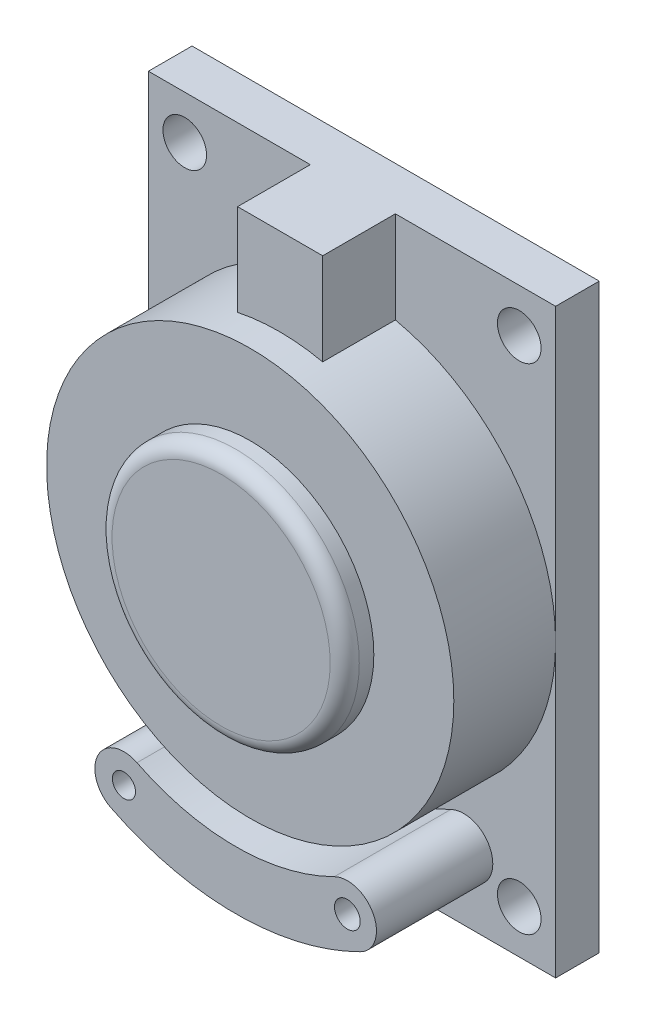
ISO-10303-21;
HEADER;
FILE_DESCRIPTION(('STEP AP214'),'2;1');
FILE_NAME('part.step','',(''),(''),'','','');
FILE_SCHEMA(('AUTOMOTIVE_DESIGN { 1 0 10303 214 1 1 1 1 }'));
ENDSEC;
DATA;
#1=APPLICATION_CONTEXT('core data for automotive mechanical design processes');
#2=APPLICATION_PROTOCOL_DEFINITION('international standard','automotive_design',2000,#1);
#3=PRODUCT_CONTEXT('',#1,'mechanical');
#4=PRODUCT('Part','Part','',(#3));
#5=PRODUCT_RELATED_PRODUCT_CATEGORY('part','',(#4));
#6=PRODUCT_DEFINITION_FORMATION('','',#4);
#7=PRODUCT_DEFINITION_CONTEXT('part definition',#1,'design');
#8=PRODUCT_DEFINITION('design','',#6,#7);
#9=PRODUCT_DEFINITION_SHAPE('','',#8);
#10=(LENGTH_UNIT() NAMED_UNIT(*) SI_UNIT(.MILLI.,.METRE.));
#11=(NAMED_UNIT(*) PLANE_ANGLE_UNIT() SI_UNIT($,.RADIAN.));
#12=(NAMED_UNIT(*) SI_UNIT($,.STERADIAN.) SOLID_ANGLE_UNIT());
#13=UNCERTAINTY_MEASURE_WITH_UNIT(LENGTH_MEASURE(1.E-05),#10,'distance_accuracy_value','');
#14=(GEOMETRIC_REPRESENTATION_CONTEXT(3) GLOBAL_UNCERTAINTY_ASSIGNED_CONTEXT((#13)) GLOBAL_UNIT_ASSIGNED_CONTEXT((#10,
#11,#12)) REPRESENTATION_CONTEXT('',''));
#15=CARTESIAN_POINT('',(0.,0.,0.));
#16=DIRECTION('',(0.,0.,1.));
#17=DIRECTION('',(1.,0.,0.));
#18=AXIS2_PLACEMENT_3D('',#15,#16,#17);
#19=CARTESIAN_POINT('',(0.,0.,3.));
#20=DIRECTION('',(0.,0.,-1.));
#21=DIRECTION('',(-1.,0.,0.));
#22=AXIS2_PLACEMENT_3D('',#19,#20,#21);
#23=PLANE('',#22);
#24=CARTESIAN_POINT('',(-11.5,17.,3.));
#25=DIRECTION('',(0.,0.,1.));
#26=DIRECTION('',(1.,0.,0.));
#27=AXIS2_PLACEMENT_3D('',#24,#25,#26);
#28=CIRCLE('',#27,1.5);
#29=CARTESIAN_POINT('',(-10.,17.,3.));
#30=VERTEX_POINT('',#29);
#31=EDGE_CURVE('E199',#30,#30,#28,.T.);
#32=ORIENTED_EDGE('',*,*,#31,.F.);
#33=EDGE_LOOP('',(#32));
#34=FACE_BOUND('',#33,.T.);
#35=DIRECTION('',(0.,-1.,0.));
#36=VECTOR('',#35,1.);
#37=CARTESIAN_POINT('',(-2.867395891409,20.,3.));
#38=LINE('',#37,#36);
#39=CARTESIAN_POINT('',(-2.867395891409,20.,3.));
#40=VERTEX_POINT('',#39);
#41=CARTESIAN_POINT('',(-2.867395891409,13.7032127912373,3.));
#42=VERTEX_POINT('',#41);
#43=EDGE_CURVE('E215',#40,#42,#38,.T.);
#44=ORIENTED_EDGE('',*,*,#43,.F.);
#45=DIRECTION('',(-1.,0.,0.));
#46=VECTOR('',#45,1.);
#47=CARTESIAN_POINT('',(-14.,20.,3.));
#48=LINE('',#47,#46);
#49=CARTESIAN_POINT('',(-14.,20.,3.));
#50=VERTEX_POINT('',#49);
#51=EDGE_CURVE('E283',#40,#50,#48,.T.);
#52=ORIENTED_EDGE('',*,*,#51,.T.);
#53=DIRECTION('',(0.,-1.,0.));
#54=VECTOR('',#53,1.);
#55=CARTESIAN_POINT('',(-14.,-20.,3.));
#56=LINE('',#55,#54);
#57=CARTESIAN_POINT('',(-14.,0.,3.));
#58=VERTEX_POINT('',#57);
#59=EDGE_CURVE('E289',#50,#58,#56,.T.);
#60=ORIENTED_EDGE('',*,*,#59,.T.);
#61=CARTESIAN_POINT('',(0.,0.,3.));
#62=DIRECTION('',(0.,0.,1.));
#63=DIRECTION('',(1.,0.,0.));
#64=AXIS2_PLACEMENT_3D('',#61,#62,#63);
#65=CIRCLE('',#64,14.);
#66=EDGE_CURVE('E268',#42,#58,#65,.T.);
#67=ORIENTED_EDGE('',*,*,#66,.F.);
#68=EDGE_LOOP('',(#44,#52,#60,#67));
#69=FACE_BOUND('',#68,.T.);
#70=ADVANCED_FACE('F36',(#34,#69),#23,.F.);
#71=CARTESIAN_POINT('',(11.5,17.,3.));
#72=DIRECTION('',(0.,0.,1.));
#73=DIRECTION('',(1.,0.,0.));
#74=AXIS2_PLACEMENT_3D('',#71,#72,#73);
#75=CIRCLE('',#74,1.5);
#76=CARTESIAN_POINT('',(13.,17.,3.));
#77=VERTEX_POINT('',#76);
#78=EDGE_CURVE('E196',#77,#77,#75,.T.);
#79=ORIENTED_EDGE('',*,*,#78,.F.);
#80=EDGE_LOOP('',(#79));
#81=FACE_BOUND('',#80,.T.);
#82=DIRECTION('',(0.,1.,0.));
#83=VECTOR('',#82,1.);
#84=CARTESIAN_POINT('',(2.98325027085986,20.,3.));
#85=LINE('',#84,#83);
#86=CARTESIAN_POINT('',(2.98325027085986,13.6784581668189,3.));
#87=VERTEX_POINT('',#86);
#88=CARTESIAN_POINT('',(2.98325027085986,20.,3.));
#89=VERTEX_POINT('',#88);
#90=EDGE_CURVE('E210',#87,#89,#85,.T.);
#91=ORIENTED_EDGE('',*,*,#90,.F.);
#92=CARTESIAN_POINT('',(14.,0.,3.));
#93=VERTEX_POINT('',#92);
#94=EDGE_CURVE('E278',#93,#87,#65,.T.);
#95=ORIENTED_EDGE('',*,*,#94,.F.);
#96=DIRECTION('',(0.,1.,0.));
#97=VECTOR('',#96,1.);
#98=CARTESIAN_POINT('',(14.,-20.,3.));
#99=LINE('',#98,#97);
#100=CARTESIAN_POINT('',(14.,20.,3.));
#101=VERTEX_POINT('',#100);
#102=EDGE_CURVE('E284',#93,#101,#99,.T.);
#103=ORIENTED_EDGE('',*,*,#102,.T.);
#104=EDGE_CURVE('E285',#101,#89,#48,.T.);
#105=ORIENTED_EDGE('',*,*,#104,.T.);
#106=EDGE_LOOP('',(#91,#95,#103,#105));
#107=FACE_BOUND('',#106,.T.);
#108=ADVANCED_FACE('F375',(#81,#107),#23,.F.);
#109=CARTESIAN_POINT('',(0.,0.,10.));
#110=DIRECTION('',(0.,0.,-1.));
#111=DIRECTION('',(-1.,0.,0.));
#112=AXIS2_PLACEMENT_3D('',#109,#110,#111);
#113=CYLINDRICAL_SURFACE('',#112,14.);
#114=CARTESIAN_POINT('',(0.,0.,10.));
#115=DIRECTION('',(0.,0.,1.));
#116=DIRECTION('',(1.,0.,0.));
#117=AXIS2_PLACEMENT_3D('',#114,#115,#116);
#118=CIRCLE('',#117,14.);
#119=CARTESIAN_POINT('',(14.,0.,10.));
#120=VERTEX_POINT('',#119);
#121=EDGE_CURVE('E274',#120,#120,#118,.T.);
#122=ORIENTED_EDGE('',*,*,#121,.F.);
#123=EDGE_LOOP('',(#122));
#124=FACE_BOUND('',#123,.T.);
#125=DIRECTION('',(0.,0.,-1.));
#126=VECTOR('',#125,1.);
#127=CARTESIAN_POINT('',(-2.867395891409,13.7032127912373,10.));
#128=LINE('',#127,#126);
#129=CARTESIAN_POINT('',(-2.867395891409,13.7032127912373,8.));
#130=VERTEX_POINT('',#129);
#131=EDGE_CURVE('E44',#42,#130,#128,.F.);
#132=ORIENTED_EDGE('',*,*,#131,.F.);
#133=ORIENTED_EDGE('',*,*,#66,.T.);
#134=EDGE_CURVE('E273',#58,#93,#65,.T.);
#135=ORIENTED_EDGE('',*,*,#134,.T.);
#136=ORIENTED_EDGE('',*,*,#94,.T.);
#137=DIRECTION('',(0.,0.,-1.));
#138=VECTOR('',#137,1.);
#139=CARTESIAN_POINT('',(2.98325027085986,13.6784581668189,10.));
#140=LINE('',#139,#138);
#141=CARTESIAN_POINT('',(2.98325027085986,13.6784581668189,8.));
#142=VERTEX_POINT('',#141);
#143=EDGE_CURVE('E322',#142,#87,#140,.T.);
#144=ORIENTED_EDGE('',*,*,#143,.F.);
#145=CARTESIAN_POINT('',(0.,0.,8.));
#146=DIRECTION('',(0.,0.,1.));
#147=DIRECTION('',(1.,0.,0.));
#148=AXIS2_PLACEMENT_3D('',#145,#146,#147);
#149=CIRCLE('',#148,14.);
#150=EDGE_CURVE('E319',#142,#130,#149,.T.);
#151=ORIENTED_EDGE('',*,*,#150,.T.);
#152=EDGE_LOOP('',(#132,#133,#135,#136,#144,#151));
#153=FACE_BOUND('',#152,.T.);
#154=ADVANCED_FACE('F382',(#124,#153),#113,.T.);
#155=CARTESIAN_POINT('',(14.,-20.,3.));
#156=DIRECTION('',(-1.,0.,0.));
#157=DIRECTION('',(0.,0.,1.));
#158=AXIS2_PLACEMENT_3D('',#155,#156,#157);
#159=PLANE('',#158);
#160=DIRECTION('',(0.,1.,0.));
#161=VECTOR('',#160,1.);
#162=CARTESIAN_POINT('',(14.,-20.,0.));
#163=LINE('',#162,#161);
#164=CARTESIAN_POINT('',(14.,-20.,0.));
#165=VERTEX_POINT('',#164);
#166=CARTESIAN_POINT('',(14.,20.,0.));
#167=VERTEX_POINT('',#166);
#168=EDGE_CURVE('E277',#165,#167,#163,.T.);
#169=ORIENTED_EDGE('',*,*,#168,.T.);
#170=DIRECTION('',(0.,0.,-1.));
#171=VECTOR('',#170,1.);
#172=CARTESIAN_POINT('',(14.,20.,3.));
#173=LINE('',#172,#171);
#174=EDGE_CURVE('E311',#101,#167,#173,.T.);
#175=ORIENTED_EDGE('',*,*,#174,.F.);
#176=ORIENTED_EDGE('',*,*,#102,.F.);
#177=CARTESIAN_POINT('',(14.,-20.,3.));
#178=VERTEX_POINT('',#177);
#179=EDGE_CURVE('E281',#178,#93,#99,.T.);
#180=ORIENTED_EDGE('',*,*,#179,.F.);
#181=DIRECTION('',(0.,0.,-1.));
#182=VECTOR('',#181,1.);
#183=CARTESIAN_POINT('',(14.,-20.,3.));
#184=LINE('',#183,#182);
#185=EDGE_CURVE('E294',#178,#165,#184,.T.);
#186=ORIENTED_EDGE('',*,*,#185,.T.);
#187=EDGE_LOOP('',(#169,#175,#176,#180,#186));
#188=FACE_BOUND('',#187,.T.);
#189=ADVANCED_FACE('F353',(#188),#159,.F.);
#190=CARTESIAN_POINT('',(-14.,20.,3.));
#191=DIRECTION('',(0.,-1.,0.));
#192=DIRECTION('',(0.,0.,-1.));
#193=AXIS2_PLACEMENT_3D('',#190,#191,#192);
#194=PLANE('',#193);
#195=DIRECTION('',(-1.,0.,0.));
#196=VECTOR('',#195,1.);
#197=CARTESIAN_POINT('',(-14.,20.,0.));
#198=LINE('',#197,#196);
#199=CARTESIAN_POINT('',(-14.,20.,0.));
#200=VERTEX_POINT('',#199);
#201=EDGE_CURVE('E297',#167,#200,#198,.T.);
#202=ORIENTED_EDGE('',*,*,#201,.T.);
#203=DIRECTION('',(0.,0.,-1.));
#204=VECTOR('',#203,1.);
#205=CARTESIAN_POINT('',(-14.,20.,3.));
#206=LINE('',#205,#204);
#207=EDGE_CURVE('E308',#50,#200,#206,.T.);
#208=ORIENTED_EDGE('',*,*,#207,.F.);
#209=ORIENTED_EDGE('',*,*,#51,.F.);
#210=DIRECTION('',(0.,0.,-1.));
#211=VECTOR('',#210,1.);
#212=CARTESIAN_POINT('',(-2.867395891409,20.,8.));
#213=LINE('',#212,#211);
#214=CARTESIAN_POINT('',(-2.867395891409,20.,8.));
#215=VERTEX_POINT('',#214);
#216=EDGE_CURVE('E214',#215,#40,#213,.T.);
#217=ORIENTED_EDGE('',*,*,#216,.F.);
#218=DIRECTION('',(-1.,0.,0.));
#219=VECTOR('',#218,1.);
#220=CARTESIAN_POINT('',(-2.867395891409,20.,8.));
#221=LINE('',#220,#219);
#222=CARTESIAN_POINT('',(2.98325027085986,20.,8.));
#223=VERTEX_POINT('',#222);
#224=EDGE_CURVE('E212',#223,#215,#221,.T.);
#225=ORIENTED_EDGE('',*,*,#224,.F.);
#226=DIRECTION('',(0.,0.,-1.));
#227=VECTOR('',#226,1.);
#228=CARTESIAN_POINT('',(2.98325027085986,20.,8.));
#229=LINE('',#228,#227);
#230=EDGE_CURVE('E220',#223,#89,#229,.T.);
#231=ORIENTED_EDGE('',*,*,#230,.T.);
#232=ORIENTED_EDGE('',*,*,#104,.F.);
#233=ORIENTED_EDGE('',*,*,#174,.T.);
#234=EDGE_LOOP('',(#202,#208,#209,#217,#225,#231,#232,#233));
#235=FACE_BOUND('',#234,.T.);
#236=ADVANCED_FACE('F368',(#235),#194,.F.);
#237=CARTESIAN_POINT('',(-14.,-20.,3.));
#238=DIRECTION('',(1.,0.,0.));
#239=DIRECTION('',(0.,0.,-1.));
#240=AXIS2_PLACEMENT_3D('',#237,#238,#239);
#241=PLANE('',#240);
#242=DIRECTION('',(0.,-1.,0.));
#243=VECTOR('',#242,1.);
#244=CARTESIAN_POINT('',(-14.,-20.,0.));
#245=LINE('',#244,#243);
#246=CARTESIAN_POINT('',(-14.,-20.,0.));
#247=VERTEX_POINT('',#246);
#248=EDGE_CURVE('E299',#200,#247,#245,.T.);
#249=ORIENTED_EDGE('',*,*,#248,.T.);
#250=DIRECTION('',(0.,0.,-1.));
#251=VECTOR('',#250,1.);
#252=CARTESIAN_POINT('',(-14.,-20.,3.));
#253=LINE('',#252,#251);
#254=CARTESIAN_POINT('',(-14.,-20.,3.));
#255=VERTEX_POINT('',#254);
#256=EDGE_CURVE('E305',#255,#247,#253,.T.);
#257=ORIENTED_EDGE('',*,*,#256,.F.);
#258=EDGE_CURVE('E288',#58,#255,#56,.T.);
#259=ORIENTED_EDGE('',*,*,#258,.F.);
#260=ORIENTED_EDGE('',*,*,#59,.F.);
#261=ORIENTED_EDGE('',*,*,#207,.T.);
#262=EDGE_LOOP('',(#249,#257,#259,#260,#261));
#263=FACE_BOUND('',#262,.T.);
#264=ADVANCED_FACE('F363',(#263),#241,.F.);
#265=CARTESIAN_POINT('',(-14.,-20.,3.));
#266=DIRECTION('',(0.,1.,0.));
#267=DIRECTION('',(0.,0.,1.));
#268=AXIS2_PLACEMENT_3D('',#265,#266,#267);
#269=PLANE('',#268);
#270=DIRECTION('',(1.,0.,0.));
#271=VECTOR('',#270,1.);
#272=CARTESIAN_POINT('',(-14.,-20.,0.));
#273=LINE('',#272,#271);
#274=EDGE_CURVE('E301',#247,#165,#273,.T.);
#275=ORIENTED_EDGE('',*,*,#274,.T.);
#276=ORIENTED_EDGE('',*,*,#185,.F.);
#277=DIRECTION('',(1.,0.,0.));
#278=VECTOR('',#277,1.);
#279=CARTESIAN_POINT('',(-14.,-20.,3.));
#280=LINE('',#279,#278);
#281=EDGE_CURVE('E292',#255,#178,#280,.T.);
#282=ORIENTED_EDGE('',*,*,#281,.F.);
#283=ORIENTED_EDGE('',*,*,#256,.T.);
#284=EDGE_LOOP('',(#275,#276,#282,#283));
#285=FACE_BOUND('',#284,.T.);
#286=ADVANCED_FACE('F359',(#285),#269,.F.);
#287=CARTESIAN_POINT('',(-11.5,-17.,3.));
#288=DIRECTION('',(0.,0.,1.));
#289=DIRECTION('',(1.,0.,0.));
#290=AXIS2_PLACEMENT_3D('',#287,#288,#289);
#291=CIRCLE('',#290,1.5);
#292=CARTESIAN_POINT('',(-10.,-17.,3.));
#293=VERTEX_POINT('',#292);
#294=EDGE_CURVE('E185',#293,#293,#291,.T.);
#295=ORIENTED_EDGE('',*,*,#294,.F.);
#296=EDGE_LOOP('',(#295));
#297=FACE_BOUND('',#296,.T.);
#298=CARTESIAN_POINT('',(11.5,-17.,3.));
#299=DIRECTION('',(0.,0.,1.));
#300=DIRECTION('',(1.,0.,0.));
#301=AXIS2_PLACEMENT_3D('',#298,#299,#300);
#302=CIRCLE('',#301,1.5);
#303=CARTESIAN_POINT('',(13.,-17.,3.));
#304=VERTEX_POINT('',#303);
#305=EDGE_CURVE('E200',#304,#304,#302,.T.);
#306=ORIENTED_EDGE('',*,*,#305,.F.);
#307=EDGE_LOOP('',(#306));
#308=FACE_BOUND('',#307,.T.);
#309=CARTESIAN_POINT('',(-7.68108856602017,-15.3621771320403,3.));
#310=DIRECTION('',(0.,0.,1.));
#311=DIRECTION('',(-1.,0.,0.));
#312=AXIS2_PLACEMENT_3D('',#309,#310,#311);
#313=CIRCLE('',#312,2.);
#314=CARTESIAN_POINT('',(-6.78666137502027,-13.5733227500405,3.));
#315=VERTEX_POINT('',#314);
#316=CARTESIAN_POINT('',(-8.5755157570201,-17.1510315140402,3.));
#317=VERTEX_POINT('',#316);
#318=EDGE_CURVE('E233',#315,#317,#313,.T.);
#319=ORIENTED_EDGE('',*,*,#318,.F.);
#320=CARTESIAN_POINT('',(0.,0.,3.));
#321=DIRECTION('',(0.,0.,-1.));
#322=DIRECTION('',(1.,0.,0.));
#323=AXIS2_PLACEMENT_3D('',#320,#321,#322);
#324=CIRCLE('',#323,15.1754361748175);
#325=CARTESIAN_POINT('',(6.78666137502025,-13.5733227500405,3.));
#326=VERTEX_POINT('',#325);
#327=EDGE_CURVE('E240',#326,#315,#324,.T.);
#328=ORIENTED_EDGE('',*,*,#327,.F.);
#329=CARTESIAN_POINT('',(7.68108856602016,-15.3621771320403,3.));
#330=DIRECTION('',(0.,0.,1.));
#331=DIRECTION('',(1.,0.,0.));
#332=AXIS2_PLACEMENT_3D('',#329,#330,#331);
#333=CIRCLE('',#332,2.);
#334=CARTESIAN_POINT('',(8.57551575702008,-17.1510315140402,3.));
#335=VERTEX_POINT('',#334);
#336=EDGE_CURVE('E252',#335,#326,#333,.T.);
#337=ORIENTED_EDGE('',*,*,#336,.F.);
#338=CARTESIAN_POINT('',(0.,0.,3.));
#339=DIRECTION('',(0.,0.,1.));
#340=DIRECTION('',(1.,0.,0.));
#341=AXIS2_PLACEMENT_3D('',#338,#339,#340);
#342=CIRCLE('',#341,19.1754361748175);
#343=EDGE_CURVE('E249',#317,#335,#342,.T.);
#344=ORIENTED_EDGE('',*,*,#343,.F.);
#345=EDGE_LOOP('',(#319,#328,#337,#344));
#346=FACE_BOUND('',#345,.T.);
#347=ORIENTED_EDGE('',*,*,#134,.F.);
#348=ORIENTED_EDGE('',*,*,#258,.T.);
#349=ORIENTED_EDGE('',*,*,#281,.T.);
#350=ORIENTED_EDGE('',*,*,#179,.T.);
#351=EDGE_LOOP('',(#347,#348,#349,#350));
#352=FACE_BOUND('',#351,.T.);
#353=ADVANCED_FACE('F340',(#297,#308,#346,#352),#23,.F.);
#354=CARTESIAN_POINT('',(0.,0.,0.));
#355=DIRECTION('',(0.,0.,-1.));
#356=DIRECTION('',(-1.,0.,0.));
#357=AXIS2_PLACEMENT_3D('',#354,#355,#356);
#358=PLANE('',#357);
#359=CARTESIAN_POINT('',(0.,-5.,0.));
#360=DIRECTION('',(0.,0.,-1.));
#361=DIRECTION('',(-1.,0.,0.));
#362=AXIS2_PLACEMENT_3D('',#359,#360,#361);
#363=CIRCLE('',#362,12.);
#364=CARTESIAN_POINT('',(12.,-5.,0.));
#365=VERTEX_POINT('',#364);
#366=CARTESIAN_POINT('',(-12.,-5.,0.));
#367=VERTEX_POINT('',#366);
#368=EDGE_CURVE('E51',#365,#367,#363,.T.);
#369=ORIENTED_EDGE('',*,*,#368,.F.);
#370=DIRECTION('',(0.,-1.,0.));
#371=VECTOR('',#370,1.);
#372=CARTESIAN_POINT('',(12.,-5.,0.));
#373=LINE('',#372,#371);
#374=CARTESIAN_POINT('',(12.,5.,0.));
#375=VERTEX_POINT('',#374);
#376=EDGE_CURVE('E177',#375,#365,#373,.T.);
#377=ORIENTED_EDGE('',*,*,#376,.F.);
#378=CARTESIAN_POINT('',(0.,5.,0.));
#379=DIRECTION('',(0.,0.,-1.));
#380=DIRECTION('',(-1.,0.,0.));
#381=AXIS2_PLACEMENT_3D('',#378,#379,#380);
#382=CIRCLE('',#381,12.);
#383=CARTESIAN_POINT('',(-12.,5.,0.));
#384=VERTEX_POINT('',#383);
#385=EDGE_CURVE('E159',#384,#375,#382,.T.);
#386=ORIENTED_EDGE('',*,*,#385,.F.);
#387=DIRECTION('',(0.,1.,0.));
#388=VECTOR('',#387,1.);
#389=CARTESIAN_POINT('',(-12.,-5.,0.));
#390=LINE('',#389,#388);
#391=EDGE_CURVE('E170',#367,#384,#390,.T.);
#392=ORIENTED_EDGE('',*,*,#391,.F.);
#393=EDGE_LOOP('',(#369,#377,#386,#392));
#394=FACE_BOUND('',#393,.T.);
#395=CARTESIAN_POINT('',(-11.5,-17.,0.));
#396=DIRECTION('',(0.,0.,-1.));
#397=DIRECTION('',(-1.,0.,0.));
#398=AXIS2_PLACEMENT_3D('',#395,#396,#397);
#399=CIRCLE('',#398,1.5);
#400=CARTESIAN_POINT('',(-13.,-17.,0.));
#401=VERTEX_POINT('',#400);
#402=EDGE_CURVE('E217',#401,#401,#399,.T.);
#403=ORIENTED_EDGE('',*,*,#402,.F.);
#404=EDGE_LOOP('',(#403));
#405=FACE_BOUND('',#404,.T.);
#406=CARTESIAN_POINT('',(11.5,-17.,0.));
#407=DIRECTION('',(0.,0.,-1.));
#408=DIRECTION('',(-1.,0.,0.));
#409=AXIS2_PLACEMENT_3D('',#406,#407,#408);
#410=CIRCLE('',#409,1.5);
#411=CARTESIAN_POINT('',(10.,-17.,0.));
#412=VERTEX_POINT('',#411);
#413=EDGE_CURVE('E330',#412,#412,#410,.T.);
#414=ORIENTED_EDGE('',*,*,#413,.F.);
#415=EDGE_LOOP('',(#414));
#416=FACE_BOUND('',#415,.T.);
#417=CARTESIAN_POINT('',(11.5,17.,0.));
#418=DIRECTION('',(0.,0.,-1.));
#419=DIRECTION('',(-1.,0.,0.));
#420=AXIS2_PLACEMENT_3D('',#417,#418,#419);
#421=CIRCLE('',#420,1.5);
#422=CARTESIAN_POINT('',(10.,17.,0.));
#423=VERTEX_POINT('',#422);
#424=EDGE_CURVE('E327',#423,#423,#421,.T.);
#425=ORIENTED_EDGE('',*,*,#424,.F.);
#426=EDGE_LOOP('',(#425));
#427=FACE_BOUND('',#426,.T.);
#428=CARTESIAN_POINT('',(-11.5,17.,0.));
#429=DIRECTION('',(0.,0.,-1.));
#430=DIRECTION('',(-1.,0.,0.));
#431=AXIS2_PLACEMENT_3D('',#428,#429,#430);
#432=CIRCLE('',#431,1.5);
#433=CARTESIAN_POINT('',(-13.,17.,0.));
#434=VERTEX_POINT('',#433);
#435=EDGE_CURVE('E207',#434,#434,#432,.T.);
#436=ORIENTED_EDGE('',*,*,#435,.F.);
#437=EDGE_LOOP('',(#436));
#438=FACE_BOUND('',#437,.T.);
#439=ORIENTED_EDGE('',*,*,#168,.F.);
#440=ORIENTED_EDGE('',*,*,#274,.F.);
#441=ORIENTED_EDGE('',*,*,#248,.F.);
#442=ORIENTED_EDGE('',*,*,#201,.F.);
#443=EDGE_LOOP('',(#439,#440,#441,#442));
#444=FACE_BOUND('',#443,.T.);
#445=ADVANCED_FACE('F174',(#394,#405,#416,#427,#438,#444),#358,.T.);
#446=CARTESIAN_POINT('',(0.,0.,10.));
#447=DIRECTION('',(0.,0.,1.));
#448=DIRECTION('',(1.,0.,0.));
#449=AXIS2_PLACEMENT_3D('',#446,#447,#448);
#450=PLANE('',#449);
#451=CARTESIAN_POINT('',(0.,0.,10.));
#452=DIRECTION('',(0.,0.,1.));
#453=DIRECTION('',(1.,0.,0.));
#454=AXIS2_PLACEMENT_3D('',#451,#452,#453);
#455=CIRCLE('',#454,8.5);
#456=CARTESIAN_POINT('',(8.5,0.,10.));
#457=VERTEX_POINT('',#456);
#458=EDGE_CURVE('E269',#457,#457,#455,.T.);
#459=ORIENTED_EDGE('',*,*,#458,.F.);
#460=EDGE_LOOP('',(#459));
#461=FACE_BOUND('',#460,.T.);
#462=ORIENTED_EDGE('',*,*,#121,.T.);
#463=EDGE_LOOP('',(#462));
#464=FACE_BOUND('',#463,.T.);
#465=ADVANCED_FACE('F339',(#461,#464),#450,.T.);
#466=CARTESIAN_POINT('',(0.,0.,12.));
#467=DIRECTION('',(0.,0.,-1.));
#468=DIRECTION('',(-1.,0.,0.));
#469=AXIS2_PLACEMENT_3D('',#466,#467,#468);
#470=CYLINDRICAL_SURFACE('',#469,8.5);
#471=CARTESIAN_POINT('',(0.,0.,11.));
#472=DIRECTION('',(0.,0.,1.));
#473=DIRECTION('',(1.,0.,0.));
#474=AXIS2_PLACEMENT_3D('',#471,#472,#473);
#475=CIRCLE('',#474,8.5);
#476=CARTESIAN_POINT('',(8.5,0.,11.));
#477=VERTEX_POINT('',#476);
#478=EDGE_CURVE('E316',#477,#477,#475,.F.);
#479=ORIENTED_EDGE('',*,*,#478,.T.);
#480=EDGE_LOOP('',(#479));
#481=FACE_BOUND('',#480,.T.);
#482=ORIENTED_EDGE('',*,*,#458,.T.);
#483=EDGE_LOOP('',(#482));
#484=FACE_BOUND('',#483,.T.);
#485=ADVANCED_FACE('F448',(#481,#484),#470,.T.);
#486=CARTESIAN_POINT('',(0.,0.,12.));
#487=DIRECTION('',(0.,0.,1.));
#488=DIRECTION('',(1.,0.,0.));
#489=AXIS2_PLACEMENT_3D('',#486,#487,#488);
#490=PLANE('',#489);
#491=CARTESIAN_POINT('',(0.,0.,12.));
#492=DIRECTION('',(0.,0.,1.));
#493=DIRECTION('',(1.,0.,0.));
#494=AXIS2_PLACEMENT_3D('',#491,#492,#493);
#495=CIRCLE('',#494,7.5);
#496=CARTESIAN_POINT('',(7.5,0.,12.));
#497=VERTEX_POINT('',#496);
#498=EDGE_CURVE('E272',#497,#497,#495,.T.);
#499=ORIENTED_EDGE('',*,*,#498,.T.);
#500=EDGE_LOOP('',(#499));
#501=FACE_BOUND('',#500,.T.);
#502=ADVANCED_FACE('F445',(#501),#490,.T.);
#503=CARTESIAN_POINT('',(0.,0.,11.));
#504=DIRECTION('',(0.,0.,1.));
#505=DIRECTION('',(1.,0.,0.));
#506=AXIS2_PLACEMENT_3D('',#503,#504,#505);
#507=TOROIDAL_SURFACE('',#506,7.5,1.);
#508=ORIENTED_EDGE('',*,*,#478,.F.);
#509=EDGE_LOOP('',(#508));
#510=FACE_BOUND('',#509,.T.);
#511=ORIENTED_EDGE('',*,*,#498,.F.);
#512=EDGE_LOOP('',(#511));
#513=FACE_BOUND('',#512,.T.);
#514=ADVANCED_FACE('F429',(#510,#513),#507,.T.);
#515=CARTESIAN_POINT('',(-3.84054428301008,-7.68108856602017,11.));
#516=DIRECTION('',(0.,0.,-1.));
#517=DIRECTION('',(-1.,0.,0.));
#518=AXIS2_PLACEMENT_3D('',#515,#516,#517);
#519=PLANE('',#518);
#520=CARTESIAN_POINT('',(-7.68108856602017,-15.3621771320403,11.));
#521=DIRECTION('',(0.,0.,1.));
#522=DIRECTION('',(-1.,0.,0.));
#523=AXIS2_PLACEMENT_3D('',#520,#521,#522);
#524=CIRCLE('',#523,2.);
#525=CARTESIAN_POINT('',(-6.78666137502027,-13.5733227500405,11.));
#526=VERTEX_POINT('',#525);
#527=CARTESIAN_POINT('',(-8.5755157570201,-17.1510315140402,11.));
#528=VERTEX_POINT('',#527);
#529=EDGE_CURVE('E236',#526,#528,#524,.T.);
#530=ORIENTED_EDGE('',*,*,#529,.T.);
#531=CARTESIAN_POINT('',(0.,0.,11.));
#532=DIRECTION('',(0.,0.,1.));
#533=DIRECTION('',(1.,0.,0.));
#534=AXIS2_PLACEMENT_3D('',#531,#532,#533);
#535=CIRCLE('',#534,19.1754361748175);
#536=CARTESIAN_POINT('',(8.57551575702008,-17.1510315140402,11.));
#537=VERTEX_POINT('',#536);
#538=EDGE_CURVE('E239',#528,#537,#535,.T.);
#539=ORIENTED_EDGE('',*,*,#538,.T.);
#540=CARTESIAN_POINT('',(7.68108856602016,-15.3621771320403,11.));
#541=DIRECTION('',(0.,0.,1.));
#542=DIRECTION('',(1.,0.,0.));
#543=AXIS2_PLACEMENT_3D('',#540,#541,#542);
#544=CIRCLE('',#543,2.);
#545=CARTESIAN_POINT('',(6.78666137502025,-13.5733227500405,11.));
#546=VERTEX_POINT('',#545);
#547=EDGE_CURVE('E242',#537,#546,#544,.T.);
#548=ORIENTED_EDGE('',*,*,#547,.T.);
#549=CARTESIAN_POINT('',(0.,0.,11.));
#550=DIRECTION('',(0.,0.,-1.));
#551=DIRECTION('',(1.,0.,0.));
#552=AXIS2_PLACEMENT_3D('',#549,#550,#551);
#553=CIRCLE('',#552,15.1754361748175);
#554=EDGE_CURVE('E244',#546,#526,#553,.T.);
#555=ORIENTED_EDGE('',*,*,#554,.T.);
#556=EDGE_LOOP('',(#530,#539,#548,#555));
#557=FACE_BOUND('',#556,.T.);
#558=CARTESIAN_POINT('',(7.68108856602016,-15.3621771320403,11.));
#559=DIRECTION('',(0.,0.,1.));
#560=DIRECTION('',(1.,0.,0.));
#561=AXIS2_PLACEMENT_3D('',#558,#559,#560);
#562=CIRCLE('',#561,0.884555983898678);
#563=CARTESIAN_POINT('',(8.56564454991884,-15.3621771320403,11.));
#564=VERTEX_POINT('',#563);
#565=EDGE_CURVE('E230',#564,#564,#562,.T.);
#566=ORIENTED_EDGE('',*,*,#565,.F.);
#567=EDGE_LOOP('',(#566));
#568=FACE_BOUND('',#567,.T.);
#569=CARTESIAN_POINT('',(-7.68108856602017,-15.3621771320403,11.));
#570=DIRECTION('',(0.,0.,1.));
#571=DIRECTION('',(1.,0.,0.));
#572=AXIS2_PLACEMENT_3D('',#569,#570,#571);
#573=CIRCLE('',#572,0.793635750251342);
#574=CARTESIAN_POINT('',(-6.88745281576883,-15.3621771320403,11.));
#575=VERTEX_POINT('',#574);
#576=EDGE_CURVE('E224',#575,#575,#573,.T.);
#577=ORIENTED_EDGE('',*,*,#576,.F.);
#578=EDGE_LOOP('',(#577));
#579=FACE_BOUND('',#578,.T.);
#580=ADVANCED_FACE('F425',(#557,#568,#579),#519,.F.);
#581=CARTESIAN_POINT('',(-7.68108856602017,-15.3621771320403,11.));
#582=DIRECTION('',(0.,0.,-1.));
#583=DIRECTION('',(-1.,0.,0.));
#584=AXIS2_PLACEMENT_3D('',#581,#582,#583);
#585=CYLINDRICAL_SURFACE('',#584,2.);
#586=ORIENTED_EDGE('',*,*,#318,.T.);
#587=DIRECTION('',(0.,0.,-1.));
#588=VECTOR('',#587,1.);
#589=CARTESIAN_POINT('',(-8.5755157570201,-17.1510315140402,11.));
#590=LINE('',#589,#588);
#591=EDGE_CURVE('E265',#528,#317,#590,.T.);
#592=ORIENTED_EDGE('',*,*,#591,.F.);
#593=ORIENTED_EDGE('',*,*,#529,.F.);
#594=DIRECTION('',(0.,0.,-1.));
#595=VECTOR('',#594,1.);
#596=CARTESIAN_POINT('',(-6.78666137502027,-13.5733227500405,11.));
#597=LINE('',#596,#595);
#598=EDGE_CURVE('E246',#526,#315,#597,.T.);
#599=ORIENTED_EDGE('',*,*,#598,.T.);
#600=EDGE_LOOP('',(#586,#592,#593,#599));
#601=FACE_BOUND('',#600,.T.);
#602=ADVANCED_FACE('F428',(#601),#585,.T.);
#603=CARTESIAN_POINT('',(0.,0.,11.));
#604=DIRECTION('',(0.,0.,-1.));
#605=DIRECTION('',(-1.,0.,0.));
#606=AXIS2_PLACEMENT_3D('',#603,#604,#605);
#607=CYLINDRICAL_SURFACE('',#606,19.1754361748175);
#608=ORIENTED_EDGE('',*,*,#343,.T.);
#609=DIRECTION('',(0.,0.,-1.));
#610=VECTOR('',#609,1.);
#611=CARTESIAN_POINT('',(8.57551575702008,-17.1510315140402,11.));
#612=LINE('',#611,#610);
#613=EDGE_CURVE('E262',#537,#335,#612,.T.);
#614=ORIENTED_EDGE('',*,*,#613,.F.);
#615=ORIENTED_EDGE('',*,*,#538,.F.);
#616=ORIENTED_EDGE('',*,*,#591,.T.);
#617=EDGE_LOOP('',(#608,#614,#615,#616));
#618=FACE_BOUND('',#617,.T.);
#619=ADVANCED_FACE('F437',(#618),#607,.T.);
#620=CARTESIAN_POINT('',(7.68108856602016,-15.3621771320403,11.));
#621=DIRECTION('',(0.,0.,-1.));
#622=DIRECTION('',(-1.,0.,0.));
#623=AXIS2_PLACEMENT_3D('',#620,#621,#622);
#624=CYLINDRICAL_SURFACE('',#623,2.);
#625=ORIENTED_EDGE('',*,*,#336,.T.);
#626=DIRECTION('',(0.,0.,-1.));
#627=VECTOR('',#626,1.);
#628=CARTESIAN_POINT('',(6.78666137502025,-13.5733227500405,11.));
#629=LINE('',#628,#627);
#630=EDGE_CURVE('E259',#546,#326,#629,.T.);
#631=ORIENTED_EDGE('',*,*,#630,.F.);
#632=ORIENTED_EDGE('',*,*,#547,.F.);
#633=ORIENTED_EDGE('',*,*,#613,.T.);
#634=EDGE_LOOP('',(#625,#631,#632,#633));
#635=FACE_BOUND('',#634,.T.);
#636=ADVANCED_FACE('F433',(#635),#624,.T.);
#637=CARTESIAN_POINT('',(0.,0.,11.));
#638=DIRECTION('',(0.,0.,-1.));
#639=DIRECTION('',(-1.,0.,0.));
#640=AXIS2_PLACEMENT_3D('',#637,#638,#639);
#641=CYLINDRICAL_SURFACE('',#640,15.1754361748175);
#642=ORIENTED_EDGE('',*,*,#327,.T.);
#643=ORIENTED_EDGE('',*,*,#598,.F.);
#644=ORIENTED_EDGE('',*,*,#554,.F.);
#645=ORIENTED_EDGE('',*,*,#630,.T.);
#646=EDGE_LOOP('',(#642,#643,#644,#645));
#647=FACE_BOUND('',#646,.T.);
#648=ADVANCED_FACE('F420',(#647),#641,.F.);
#649=CARTESIAN_POINT('',(7.68108856602016,-15.3621771320403,11.));
#650=DIRECTION('',(0.,0.,-1.));
#651=DIRECTION('',(-1.,0.,0.));
#652=AXIS2_PLACEMENT_3D('',#649,#650,#651);
#653=CYLINDRICAL_SURFACE('',#652,0.884555983898678);
#654=ORIENTED_EDGE('',*,*,#565,.T.);
#655=EDGE_LOOP('',(#654));
#656=FACE_BOUND('',#655,.T.);
#657=CARTESIAN_POINT('',(7.68108856602016,-15.3621771320403,3.));
#658=DIRECTION('',(0.,0.,1.));
#659=DIRECTION('',(1.,0.,0.));
#660=AXIS2_PLACEMENT_3D('',#657,#658,#659);
#661=CIRCLE('',#660,0.884555983898678);
#662=CARTESIAN_POINT('',(8.56564454991884,-15.3621771320403,3.));
#663=VERTEX_POINT('',#662);
#664=EDGE_CURVE('E227',#663,#663,#661,.T.);
#665=ORIENTED_EDGE('',*,*,#664,.F.);
#666=EDGE_LOOP('',(#665));
#667=FACE_BOUND('',#666,.T.);
#668=ADVANCED_FACE('F414',(#656,#667),#653,.F.);
#669=CARTESIAN_POINT('',(-7.68108856602017,-15.3621771320403,11.));
#670=DIRECTION('',(0.,0.,-1.));
#671=DIRECTION('',(-1.,0.,0.));
#672=AXIS2_PLACEMENT_3D('',#669,#670,#671);
#673=CYLINDRICAL_SURFACE('',#672,0.793635750251342);
#674=ORIENTED_EDGE('',*,*,#576,.T.);
#675=EDGE_LOOP('',(#674));
#676=FACE_BOUND('',#675,.T.);
#677=CARTESIAN_POINT('',(-7.68108856602017,-15.3621771320403,3.));
#678=DIRECTION('',(0.,0.,1.));
#679=DIRECTION('',(1.,0.,0.));
#680=AXIS2_PLACEMENT_3D('',#677,#678,#679);
#681=CIRCLE('',#680,0.793635750251342);
#682=CARTESIAN_POINT('',(-6.88745281576883,-15.3621771320403,3.));
#683=VERTEX_POINT('',#682);
#684=EDGE_CURVE('E223',#683,#683,#681,.T.);
#685=ORIENTED_EDGE('',*,*,#684,.F.);
#686=EDGE_LOOP('',(#685));
#687=FACE_BOUND('',#686,.T.);
#688=ADVANCED_FACE('F409',(#676,#687),#673,.F.);
#689=ORIENTED_EDGE('',*,*,#664,.T.);
#690=EDGE_LOOP('',(#689));
#691=FACE_BOUND('',#690,.T.);
#692=ADVANCED_FACE('F400',(#691),#23,.F.);
#693=ORIENTED_EDGE('',*,*,#684,.T.);
#694=EDGE_LOOP('',(#693));
#695=FACE_BOUND('',#694,.T.);
#696=ADVANCED_FACE('F388',(#695),#23,.F.);
#697=CARTESIAN_POINT('',(-2.867395891409,20.,8.));
#698=DIRECTION('',(1.,0.,0.));
#699=DIRECTION('',(0.,0.,-1.));
#700=AXIS2_PLACEMENT_3D('',#697,#698,#699);
#701=PLANE('',#700);
#702=ORIENTED_EDGE('',*,*,#43,.T.);
#703=ORIENTED_EDGE('',*,*,#131,.T.);
#704=DIRECTION('',(0.,-1.,0.));
#705=VECTOR('',#704,1.);
#706=CARTESIAN_POINT('',(-2.867395891409,20.,8.));
#707=LINE('',#706,#705);
#708=EDGE_CURVE('E59',#215,#130,#707,.T.);
#709=ORIENTED_EDGE('',*,*,#708,.F.);
#710=ORIENTED_EDGE('',*,*,#216,.T.);
#711=EDGE_LOOP('',(#702,#703,#709,#710));
#712=FACE_BOUND('',#711,.T.);
#713=ADVANCED_FACE('F399',(#712),#701,.F.);
#714=CARTESIAN_POINT('',(2.98325027085986,20.,8.));
#715=DIRECTION('',(-1.,0.,0.));
#716=DIRECTION('',(0.,0.,1.));
#717=AXIS2_PLACEMENT_3D('',#714,#715,#716);
#718=PLANE('',#717);
#719=DIRECTION('',(0.,1.,0.));
#720=VECTOR('',#719,1.);
#721=CARTESIAN_POINT('',(2.98325027085986,20.,8.));
#722=LINE('',#721,#720);
#723=EDGE_CURVE('E209',#142,#223,#722,.T.);
#724=ORIENTED_EDGE('',*,*,#723,.F.);
#725=ORIENTED_EDGE('',*,*,#143,.T.);
#726=ORIENTED_EDGE('',*,*,#90,.T.);
#727=ORIENTED_EDGE('',*,*,#230,.F.);
#728=EDGE_LOOP('',(#724,#725,#726,#727));
#729=FACE_BOUND('',#728,.T.);
#730=ADVANCED_FACE('F406',(#729),#718,.F.);
#731=CARTESIAN_POINT('',(0.,0.,8.));
#732=DIRECTION('',(0.,0.,1.));
#733=DIRECTION('',(1.,0.,0.));
#734=AXIS2_PLACEMENT_3D('',#731,#732,#733);
#735=PLANE('',#734);
#736=ORIENTED_EDGE('',*,*,#150,.F.);
#737=ORIENTED_EDGE('',*,*,#723,.T.);
#738=ORIENTED_EDGE('',*,*,#224,.T.);
#739=ORIENTED_EDGE('',*,*,#708,.T.);
#740=EDGE_LOOP('',(#736,#737,#738,#739));
#741=FACE_BOUND('',#740,.T.);
#742=ADVANCED_FACE('F481',(#741),#735,.T.);
#743=CARTESIAN_POINT('',(-11.5,17.,-2.));
#744=DIRECTION('',(0.,0.,1.));
#745=DIRECTION('',(1.,0.,0.));
#746=AXIS2_PLACEMENT_3D('',#743,#744,#745);
#747=CYLINDRICAL_SURFACE('',#746,1.5);
#748=ORIENTED_EDGE('',*,*,#435,.T.);
#749=EDGE_LOOP('',(#748));
#750=FACE_BOUND('',#749,.T.);
#751=ORIENTED_EDGE('',*,*,#31,.T.);
#752=EDGE_LOOP('',(#751));
#753=FACE_BOUND('',#752,.T.);
#754=ADVANCED_FACE('F472',(#750,#753),#747,.F.);
#755=CARTESIAN_POINT('',(11.5,17.,-2.));
#756=DIRECTION('',(0.,0.,1.));
#757=DIRECTION('',(1.,0.,0.));
#758=AXIS2_PLACEMENT_3D('',#755,#756,#757);
#759=CYLINDRICAL_SURFACE('',#758,1.5);
#760=ORIENTED_EDGE('',*,*,#424,.T.);
#761=EDGE_LOOP('',(#760));
#762=FACE_BOUND('',#761,.T.);
#763=ORIENTED_EDGE('',*,*,#78,.T.);
#764=EDGE_LOOP('',(#763));
#765=FACE_BOUND('',#764,.T.);
#766=ADVANCED_FACE('F469',(#762,#765),#759,.F.);
#767=CARTESIAN_POINT('',(11.5,-17.,-2.));
#768=DIRECTION('',(0.,0.,1.));
#769=DIRECTION('',(1.,0.,0.));
#770=AXIS2_PLACEMENT_3D('',#767,#768,#769);
#771=CYLINDRICAL_SURFACE('',#770,1.5);
#772=ORIENTED_EDGE('',*,*,#413,.T.);
#773=EDGE_LOOP('',(#772));
#774=FACE_BOUND('',#773,.T.);
#775=ORIENTED_EDGE('',*,*,#305,.T.);
#776=EDGE_LOOP('',(#775));
#777=FACE_BOUND('',#776,.T.);
#778=ADVANCED_FACE('F471',(#774,#777),#771,.F.);
#779=CARTESIAN_POINT('',(-11.5,-17.,-2.));
#780=DIRECTION('',(0.,0.,1.));
#781=DIRECTION('',(1.,0.,0.));
#782=AXIS2_PLACEMENT_3D('',#779,#780,#781);
#783=CYLINDRICAL_SURFACE('',#782,1.5);
#784=ORIENTED_EDGE('',*,*,#402,.T.);
#785=EDGE_LOOP('',(#784));
#786=FACE_BOUND('',#785,.T.);
#787=ORIENTED_EDGE('',*,*,#294,.T.);
#788=EDGE_LOOP('',(#787));
#789=FACE_BOUND('',#788,.T.);
#790=ADVANCED_FACE('F335',(#786,#789),#783,.F.);
#791=CARTESIAN_POINT('',(0.,-5.,0.));
#792=DIRECTION('',(0.,0.,-1.));
#793=DIRECTION('',(-1.,0.,0.));
#794=AXIS2_PLACEMENT_3D('',#791,#792,#793);
#795=CONICAL_SURFACE('',#794,12.,0.5235987755983);
#796=ORIENTED_EDGE('',*,*,#368,.T.);
#797=DIRECTION('',(-0.500000000000001,0.,-0.866025403784438));
#798=VECTOR('',#797,1.);
#799=CARTESIAN_POINT('',(-12.,-5.,0.));
#800=LINE('',#799,#798);
#801=CARTESIAN_POINT('',(-11.1339745962156,-5.,1.5));
#802=VERTEX_POINT('',#801);
#803=EDGE_CURVE('E167',#802,#367,#800,.T.);
#804=ORIENTED_EDGE('',*,*,#803,.F.);
#805=CARTESIAN_POINT('',(0.,-5.,1.5));
#806=DIRECTION('',(0.,0.,-1.));
#807=DIRECTION('',(-1.,0.,0.));
#808=AXIS2_PLACEMENT_3D('',#805,#806,#807);
#809=CIRCLE('',#808,11.1339745962156);
#810=CARTESIAN_POINT('',(11.1339745962156,-5.,1.5));
#811=VERTEX_POINT('',#810);
#812=EDGE_CURVE('E179',#811,#802,#809,.T.);
#813=ORIENTED_EDGE('',*,*,#812,.F.);
#814=DIRECTION('',(0.500000000000001,0.,-0.866025403784438));
#815=VECTOR('',#814,1.);
#816=CARTESIAN_POINT('',(12.,-5.,0.));
#817=LINE('',#816,#815);
#818=EDGE_CURVE('E183',#811,#365,#817,.T.);
#819=ORIENTED_EDGE('',*,*,#818,.T.);
#820=EDGE_LOOP('',(#796,#804,#813,#819));
#821=FACE_BOUND('',#820,.T.);
#822=ADVANCED_FACE('F489',(#821),#795,.F.);
#823=CARTESIAN_POINT('',(12.,-5.,0.));
#824=DIRECTION('',(0.866025403784438,0.,0.500000000000001));
#825=DIRECTION('',(0.500000000000001,0.,-0.866025403784438));
#826=AXIS2_PLACEMENT_3D('',#823,#824,#825);
#827=PLANE('',#826);
#828=ORIENTED_EDGE('',*,*,#376,.T.);
#829=ORIENTED_EDGE('',*,*,#818,.F.);
#830=DIRECTION('',(0.,-1.,0.));
#831=VECTOR('',#830,1.);
#832=CARTESIAN_POINT('',(11.1339745962156,-5.,1.5));
#833=LINE('',#832,#831);
#834=CARTESIAN_POINT('',(11.1339745962156,5.,1.5));
#835=VERTEX_POINT('',#834);
#836=EDGE_CURVE('E186',#835,#811,#833,.T.);
#837=ORIENTED_EDGE('',*,*,#836,.F.);
#838=DIRECTION('',(0.500000000000001,0.,-0.866025403784438));
#839=VECTOR('',#838,1.);
#840=CARTESIAN_POINT('',(12.,5.,0.));
#841=LINE('',#840,#839);
#842=EDGE_CURVE('E166',#835,#375,#841,.T.);
#843=ORIENTED_EDGE('',*,*,#842,.T.);
#844=EDGE_LOOP('',(#828,#829,#837,#843));
#845=FACE_BOUND('',#844,.T.);
#846=ADVANCED_FACE('F485',(#845),#827,.F.);
#847=CARTESIAN_POINT('',(0.,5.,0.));
#848=DIRECTION('',(0.,0.,-1.));
#849=DIRECTION('',(-1.,0.,0.));
#850=AXIS2_PLACEMENT_3D('',#847,#848,#849);
#851=CONICAL_SURFACE('',#850,12.,0.5235987755983);
#852=ORIENTED_EDGE('',*,*,#385,.T.);
#853=ORIENTED_EDGE('',*,*,#842,.F.);
#854=CARTESIAN_POINT('',(0.,5.,1.5));
#855=DIRECTION('',(0.,0.,-1.));
#856=DIRECTION('',(-1.,0.,0.));
#857=AXIS2_PLACEMENT_3D('',#854,#855,#856);
#858=CIRCLE('',#857,11.1339745962156);
#859=CARTESIAN_POINT('',(-11.1339745962156,5.,1.5));
#860=VERTEX_POINT('',#859);
#861=EDGE_CURVE('E162',#860,#835,#858,.T.);
#862=ORIENTED_EDGE('',*,*,#861,.F.);
#863=DIRECTION('',(-0.500000000000001,0.,-0.866025403784438));
#864=VECTOR('',#863,1.);
#865=CARTESIAN_POINT('',(-12.,5.,0.));
#866=LINE('',#865,#864);
#867=EDGE_CURVE('E155',#860,#384,#866,.T.);
#868=ORIENTED_EDGE('',*,*,#867,.T.);
#869=EDGE_LOOP('',(#852,#853,#862,#868));
#870=FACE_BOUND('',#869,.T.);
#871=ADVANCED_FACE('F157',(#870),#851,.F.);
#872=CARTESIAN_POINT('',(-12.,-5.,0.));
#873=DIRECTION('',(-0.866025403784438,0.,0.500000000000001));
#874=DIRECTION('',(0.500000000000001,0.,0.866025403784438));
#875=AXIS2_PLACEMENT_3D('',#872,#873,#874);
#876=PLANE('',#875);
#877=ORIENTED_EDGE('',*,*,#391,.T.);
#878=ORIENTED_EDGE('',*,*,#867,.F.);
#879=DIRECTION('',(0.,1.,0.));
#880=VECTOR('',#879,1.);
#881=CARTESIAN_POINT('',(-11.1339745962156,-5.,1.5));
#882=LINE('',#881,#880);
#883=EDGE_CURVE('E191',#802,#860,#882,.T.);
#884=ORIENTED_EDGE('',*,*,#883,.F.);
#885=ORIENTED_EDGE('',*,*,#803,.T.);
#886=EDGE_LOOP('',(#877,#878,#884,#885));
#887=FACE_BOUND('',#886,.T.);
#888=ADVANCED_FACE('F171',(#887),#876,.F.);
#889=CARTESIAN_POINT('',(0.,-5.,1.5));
#890=DIRECTION('',(0.,0.,-1.));
#891=DIRECTION('',(-1.,0.,0.));
#892=AXIS2_PLACEMENT_3D('',#889,#890,#891);
#893=PLANE('',#892);
#894=CARTESIAN_POINT('',(0.,0.,1.5));
#895=DIRECTION('',(0.,0.,-1.));
#896=DIRECTION('',(-1.,0.,0.));
#897=AXIS2_PLACEMENT_3D('',#894,#895,#896);
#898=CIRCLE('',#897,6.5);
#899=CARTESIAN_POINT('',(-6.5,0.,1.5));
#900=VERTEX_POINT('',#899);
#901=EDGE_CURVE('E749',#900,#900,#898,.T.);
#902=ORIENTED_EDGE('',*,*,#901,.F.);
#903=EDGE_LOOP('',(#902));
#904=FACE_BOUND('',#903,.T.);
#905=ORIENTED_EDGE('',*,*,#812,.T.);
#906=ORIENTED_EDGE('',*,*,#883,.T.);
#907=ORIENTED_EDGE('',*,*,#861,.T.);
#908=ORIENTED_EDGE('',*,*,#836,.T.);
#909=EDGE_LOOP('',(#905,#906,#907,#908));
#910=FACE_BOUND('',#909,.T.);
#911=ADVANCED_FACE('F567',(#904,#910),#893,.T.);
#912=CARTESIAN_POINT('',(0.,0.,0.5));
#913=DIRECTION('',(0.,0.,-1.));
#914=DIRECTION('',(-1.,0.,0.));
#915=AXIS2_PLACEMENT_3D('',#912,#913,#914);
#916=PLANE('',#915);
#917=CARTESIAN_POINT('',(0.,0.,0.5));
#918=DIRECTION('',(0.,0.,-1.));
#919=DIRECTION('',(-1.,0.,0.));
#920=AXIS2_PLACEMENT_3D('',#917,#918,#919);
#921=CIRCLE('',#920,5.5);
#922=CARTESIAN_POINT('',(-5.5,0.,0.5));
#923=VERTEX_POINT('',#922);
#924=EDGE_CURVE('E11',#923,#923,#921,.T.);
#925=ORIENTED_EDGE('',*,*,#924,.T.);
#926=EDGE_LOOP('',(#925));
#927=FACE_BOUND('',#926,.T.);
#928=ADVANCED_FACE('F577',(#927),#916,.T.);
#929=CARTESIAN_POINT('',(0.,0.,1.5));
#930=DIRECTION('',(0.,0.,-1.));
#931=DIRECTION('',(-1.,0.,0.));
#932=AXIS2_PLACEMENT_3D('',#929,#930,#931);
#933=TOROIDAL_SURFACE('',#932,5.5,1.);
#934=ORIENTED_EDGE('',*,*,#901,.T.);
#935=EDGE_LOOP('',(#934));
#936=FACE_BOUND('',#935,.T.);
#937=ORIENTED_EDGE('',*,*,#924,.F.);
#938=EDGE_LOOP('',(#937));
#939=FACE_BOUND('',#938,.T.);
#940=ADVANCED_FACE('F38',(#936,#939),#933,.T.);
#941=CLOSED_SHELL('',(#70,#108,#154,#189,#236,#264,#286,#353,#445,#465,#485,#502,#514,#580,#602,
#619,#636,#648,#668,#688,#692,#696,#713,#730,#742,#754,#766,#778,#790,#822,#846,#871,#888,#911,
#928,#940));
#942=MANIFOLD_SOLID_BREP('B2',#941);
#943=ADVANCED_BREP_SHAPE_REPRESENTATION('',(#18,#942),#14);
#944=SHAPE_DEFINITION_REPRESENTATION(#9,#943);
ENDSEC;
END-ISO-10303-21;
